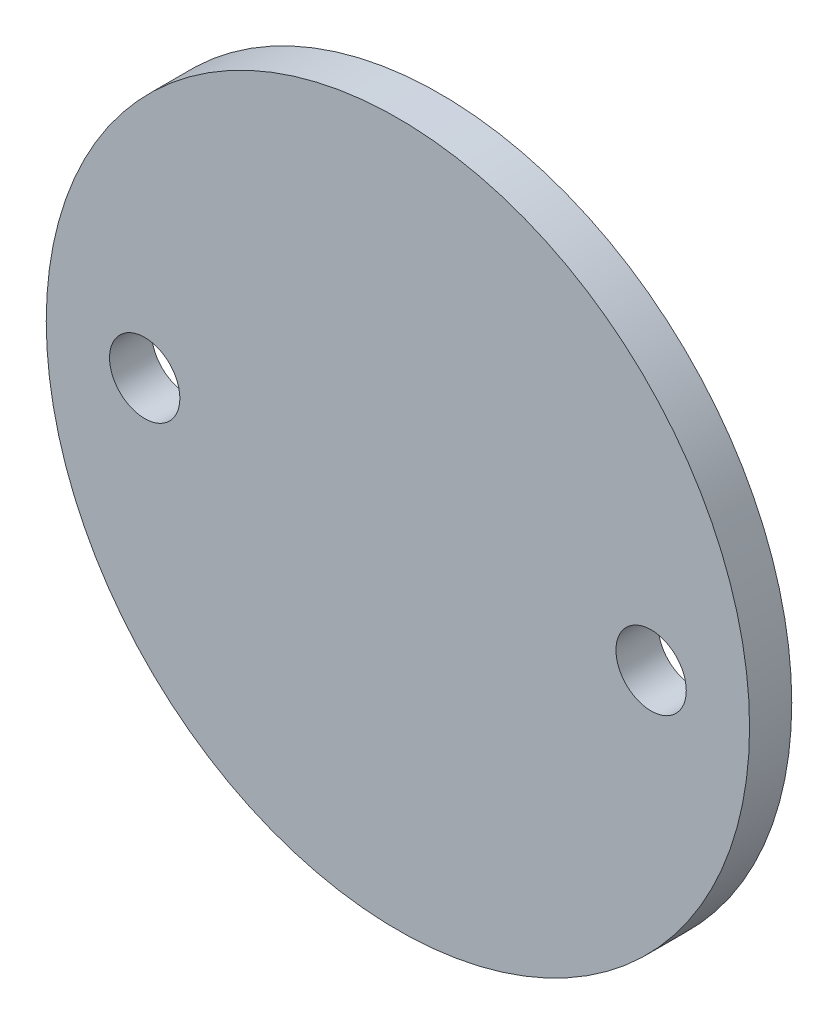
ISO-10303-21;
HEADER;
FILE_DESCRIPTION(('STEP AP214'),'2;1');
FILE_NAME('part.step','',(''),(''),'','','');
FILE_SCHEMA(('AUTOMOTIVE_DESIGN { 1 0 10303 214 1 1 1 1 }'));
ENDSEC;
DATA;
#1=APPLICATION_CONTEXT('core data for automotive mechanical design processes');
#2=APPLICATION_PROTOCOL_DEFINITION('international standard','automotive_design',2000,#1);
#3=PRODUCT_CONTEXT('',#1,'mechanical');
#4=PRODUCT('Part','Part','',(#3));
#5=PRODUCT_RELATED_PRODUCT_CATEGORY('part','',(#4));
#6=PRODUCT_DEFINITION_FORMATION('','',#4);
#7=PRODUCT_DEFINITION_CONTEXT('part definition',#1,'design');
#8=PRODUCT_DEFINITION('design','',#6,#7);
#9=PRODUCT_DEFINITION_SHAPE('','',#8);
#10=(LENGTH_UNIT() NAMED_UNIT(*) SI_UNIT(.MILLI.,.METRE.));
#11=(NAMED_UNIT(*) PLANE_ANGLE_UNIT() SI_UNIT($,.RADIAN.));
#12=(NAMED_UNIT(*) SI_UNIT($,.STERADIAN.) SOLID_ANGLE_UNIT());
#13=UNCERTAINTY_MEASURE_WITH_UNIT(LENGTH_MEASURE(1.E-05),#10,'distance_accuracy_value','');
#14=(GEOMETRIC_REPRESENTATION_CONTEXT(3) GLOBAL_UNCERTAINTY_ASSIGNED_CONTEXT((#13)) GLOBAL_UNIT_ASSIGNED_CONTEXT((#10,
#11,#12)) REPRESENTATION_CONTEXT('',''));
#15=CARTESIAN_POINT('',(0.,0.,0.));
#16=DIRECTION('',(0.,0.,1.));
#17=DIRECTION('',(1.,0.,0.));
#18=AXIS2_PLACEMENT_3D('',#15,#16,#17);
#19=CARTESIAN_POINT('',(0.,0.,3.));
#20=DIRECTION('',(0.,0.,1.));
#21=DIRECTION('',(1.,0.,0.));
#22=AXIS2_PLACEMENT_3D('',#19,#20,#21);
#23=PLANE('',#22);
#24=CARTESIAN_POINT('',(-18.,0.,3.));
#25=DIRECTION('',(0.,0.,1.));
#26=DIRECTION('',(1.,0.,0.));
#27=AXIS2_PLACEMENT_3D('',#24,#25,#26);
#28=CIRCLE('',#27,2.5);
#29=CARTESIAN_POINT('',(-15.5,0.,3.));
#30=VERTEX_POINT('',#29);
#31=EDGE_CURVE('E50',#30,#30,#28,.T.);
#32=ORIENTED_EDGE('',*,*,#31,.F.);
#33=EDGE_LOOP('',(#32));
#34=FACE_BOUND('',#33,.T.);
#35=CARTESIAN_POINT('',(0.,0.,3.));
#36=DIRECTION('',(0.,0.,1.));
#37=DIRECTION('',(1.,0.,0.));
#38=AXIS2_PLACEMENT_3D('',#35,#36,#37);
#39=CIRCLE('',#38,25.);
#40=CARTESIAN_POINT('',(25.,0.,3.));
#41=VERTEX_POINT('',#40);
#42=EDGE_CURVE('E10',#41,#41,#39,.T.);
#43=ORIENTED_EDGE('',*,*,#42,.T.);
#44=EDGE_LOOP('',(#43));
#45=FACE_BOUND('',#44,.T.);
#46=CARTESIAN_POINT('',(18.,0.,3.));
#47=DIRECTION('',(0.,0.,1.));
#48=DIRECTION('',(1.,0.,0.));
#49=AXIS2_PLACEMENT_3D('',#46,#47,#48);
#50=CIRCLE('',#49,2.5);
#51=CARTESIAN_POINT('',(20.5,0.,3.));
#52=VERTEX_POINT('',#51);
#53=EDGE_CURVE('E56',#52,#52,#50,.T.);
#54=ORIENTED_EDGE('',*,*,#53,.F.);
#55=EDGE_LOOP('',(#54));
#56=FACE_BOUND('',#55,.T.);
#57=ADVANCED_FACE('F37',(#34,#45,#56),#23,.T.);
#58=CARTESIAN_POINT('',(0.,0.,0.));
#59=DIRECTION('',(0.,0.,1.));
#60=DIRECTION('',(1.,0.,0.));
#61=AXIS2_PLACEMENT_3D('',#58,#59,#60);
#62=PLANE('',#61);
#63=CARTESIAN_POINT('',(0.,0.,0.));
#64=DIRECTION('',(0.,0.,1.));
#65=DIRECTION('',(1.,0.,0.));
#66=AXIS2_PLACEMENT_3D('',#63,#64,#65);
#67=CIRCLE('',#66,25.);
#68=CARTESIAN_POINT('',(25.,0.,0.));
#69=VERTEX_POINT('',#68);
#70=EDGE_CURVE('E41',#69,#69,#67,.T.);
#71=ORIENTED_EDGE('',*,*,#70,.F.);
#72=EDGE_LOOP('',(#71));
#73=FACE_BOUND('',#72,.T.);
#74=CARTESIAN_POINT('',(-18.,0.,0.));
#75=DIRECTION('',(0.,0.,1.));
#76=DIRECTION('',(1.,0.,0.));
#77=AXIS2_PLACEMENT_3D('',#74,#75,#76);
#78=CIRCLE('',#77,2.5);
#79=CARTESIAN_POINT('',(-15.5,0.,0.));
#80=VERTEX_POINT('',#79);
#81=EDGE_CURVE('E52',#80,#80,#78,.T.);
#82=ORIENTED_EDGE('',*,*,#81,.T.);
#83=EDGE_LOOP('',(#82));
#84=FACE_BOUND('',#83,.T.);
#85=CARTESIAN_POINT('',(18.,0.,0.));
#86=DIRECTION('',(0.,0.,1.));
#87=DIRECTION('',(1.,0.,0.));
#88=AXIS2_PLACEMENT_3D('',#85,#86,#87);
#89=CIRCLE('',#88,2.5);
#90=CARTESIAN_POINT('',(20.5,0.,0.));
#91=VERTEX_POINT('',#90);
#92=EDGE_CURVE('E60',#91,#91,#89,.T.);
#93=ORIENTED_EDGE('',*,*,#92,.T.);
#94=EDGE_LOOP('',(#93));
#95=FACE_BOUND('',#94,.T.);
#96=ADVANCED_FACE('F72',(#73,#84,#95),#62,.F.);
#97=CARTESIAN_POINT('',(0.,0.,3.));
#98=DIRECTION('',(0.,0.,-1.));
#99=DIRECTION('',(-1.,0.,0.));
#100=AXIS2_PLACEMENT_3D('',#97,#98,#99);
#101=CYLINDRICAL_SURFACE('',#100,25.);
#102=ORIENTED_EDGE('',*,*,#42,.F.);
#103=EDGE_LOOP('',(#102));
#104=FACE_BOUND('',#103,.T.);
#105=ORIENTED_EDGE('',*,*,#70,.T.);
#106=EDGE_LOOP('',(#105));
#107=FACE_BOUND('',#106,.T.);
#108=ADVANCED_FACE('F39',(#104,#107),#101,.T.);
#109=CARTESIAN_POINT('',(-18.,0.,3.));
#110=DIRECTION('',(0.,0.,-1.));
#111=DIRECTION('',(-1.,0.,0.));
#112=AXIS2_PLACEMENT_3D('',#109,#110,#111);
#113=CYLINDRICAL_SURFACE('',#112,2.5);
#114=ORIENTED_EDGE('',*,*,#31,.T.);
#115=EDGE_LOOP('',(#114));
#116=FACE_BOUND('',#115,.T.);
#117=ORIENTED_EDGE('',*,*,#81,.F.);
#118=EDGE_LOOP('',(#117));
#119=FACE_BOUND('',#118,.T.);
#120=ADVANCED_FACE('F81',(#116,#119),#113,.F.);
#121=CARTESIAN_POINT('',(18.,0.,3.));
#122=DIRECTION('',(0.,0.,-1.));
#123=DIRECTION('',(-1.,0.,0.));
#124=AXIS2_PLACEMENT_3D('',#121,#122,#123);
#125=CYLINDRICAL_SURFACE('',#124,2.5);
#126=ORIENTED_EDGE('',*,*,#53,.T.);
#127=EDGE_LOOP('',(#126));
#128=FACE_BOUND('',#127,.T.);
#129=ORIENTED_EDGE('',*,*,#92,.F.);
#130=EDGE_LOOP('',(#129));
#131=FACE_BOUND('',#130,.T.);
#132=ADVANCED_FACE('F68',(#128,#131),#125,.F.);
#133=CLOSED_SHELL('',(#57,#96,#108,#120,#132));
#134=MANIFOLD_SOLID_BREP('B2',#133);
#135=ADVANCED_BREP_SHAPE_REPRESENTATION('',(#18,#134),#14);
#136=SHAPE_DEFINITION_REPRESENTATION(#9,#135);
ENDSEC;
END-ISO-10303-21;
